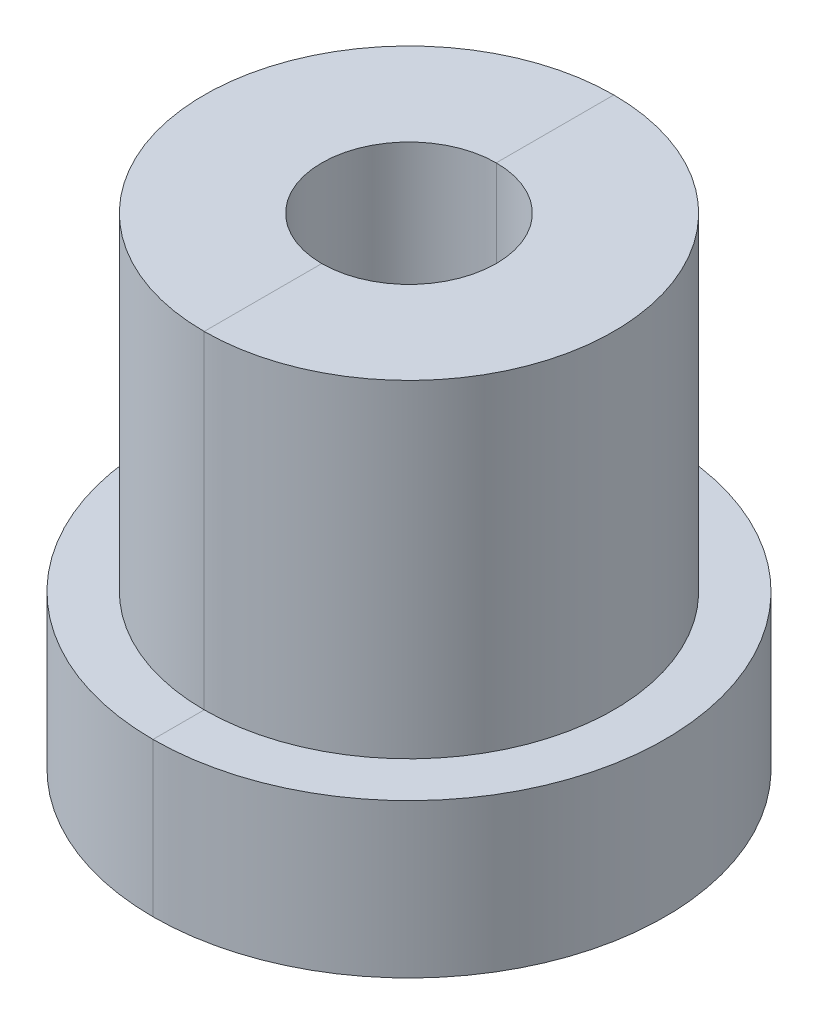
ISO-10303-21;
HEADER;
FILE_DESCRIPTION(('STEP AP214'),'2;1');
FILE_NAME('part.step','',(''),(''),'','','');
FILE_SCHEMA(('AUTOMOTIVE_DESIGN { 1 0 10303 214 1 1 1 1 }'));
ENDSEC;
DATA;
#1=APPLICATION_CONTEXT('core data for automotive mechanical design processes');
#2=APPLICATION_PROTOCOL_DEFINITION('international standard','automotive_design',2000,#1);
#3=PRODUCT_CONTEXT('',#1,'mechanical');
#4=PRODUCT('Part','Part','',(#3));
#5=PRODUCT_RELATED_PRODUCT_CATEGORY('part','',(#4));
#6=PRODUCT_DEFINITION_FORMATION('','',#4);
#7=PRODUCT_DEFINITION_CONTEXT('part definition',#1,'design');
#8=PRODUCT_DEFINITION('design','',#6,#7);
#9=PRODUCT_DEFINITION_SHAPE('','',#8);
#10=(LENGTH_UNIT() NAMED_UNIT(*) SI_UNIT(.MILLI.,.METRE.));
#11=(NAMED_UNIT(*) PLANE_ANGLE_UNIT() SI_UNIT($,.RADIAN.));
#12=(NAMED_UNIT(*) SI_UNIT($,.STERADIAN.) SOLID_ANGLE_UNIT());
#13=UNCERTAINTY_MEASURE_WITH_UNIT(LENGTH_MEASURE(1.E-05),#10,'distance_accuracy_value','');
#14=(GEOMETRIC_REPRESENTATION_CONTEXT(3) GLOBAL_UNCERTAINTY_ASSIGNED_CONTEXT((#13)) GLOBAL_UNIT_ASSIGNED_CONTEXT((#10,
#11,#12)) REPRESENTATION_CONTEXT('',''));
#15=CARTESIAN_POINT('',(0.,0.,0.));
#16=DIRECTION('',(0.,0.,1.));
#17=DIRECTION('',(1.,0.,0.));
#18=AXIS2_PLACEMENT_3D('',#15,#16,#17);
#19=CARTESIAN_POINT('',(0.,0.,0.));
#20=DIRECTION('',(0.,1.,0.));
#21=DIRECTION('',(0.,0.,1.));
#22=AXIS2_PLACEMENT_3D('',#19,#20,#21);
#23=CYLINDRICAL_SURFACE('',#22,2.7051);
#24=CARTESIAN_POINT('',(0.,0.,0.));
#25=DIRECTION('',(0.,1.,0.));
#26=DIRECTION('',(0.,0.,1.));
#27=AXIS2_PLACEMENT_3D('',#24,#25,#26);
#28=CIRCLE('',#27,2.7051);
#29=CARTESIAN_POINT('',(0.,0.,2.7051));
#30=VERTEX_POINT('',#29);
#31=CARTESIAN_POINT('',(0.,0.,-2.7051));
#32=VERTEX_POINT('',#31);
#33=EDGE_CURVE('E117',#30,#32,#28,.T.);
#34=ORIENTED_EDGE('',*,*,#33,.F.);
#35=DIRECTION('',(0.,1.,0.));
#36=VECTOR('',#35,1.);
#37=CARTESIAN_POINT('',(0.,0.,2.7051));
#38=LINE('',#37,#36);
#39=CARTESIAN_POINT('',(0.,14.9225,2.7051));
#40=VERTEX_POINT('',#39);
#41=EDGE_CURVE('E12',#30,#40,#38,.T.);
#42=ORIENTED_EDGE('',*,*,#41,.T.);
#43=CARTESIAN_POINT('',(0.,14.9225,0.));
#44=DIRECTION('',(0.,1.,0.));
#45=DIRECTION('',(0.,0.,1.));
#46=AXIS2_PLACEMENT_3D('',#43,#44,#45);
#47=CIRCLE('',#46,2.7051);
#48=CARTESIAN_POINT('',(0.,14.9225,-2.7051));
#49=VERTEX_POINT('',#48);
#50=EDGE_CURVE('E118',#40,#49,#47,.T.);
#51=ORIENTED_EDGE('',*,*,#50,.T.);
#52=DIRECTION('',(0.,-1.,0.));
#53=VECTOR('',#52,1.);
#54=CARTESIAN_POINT('',(0.,0.,-2.7051));
#55=LINE('',#54,#53);
#56=EDGE_CURVE('E51',#49,#32,#55,.T.);
#57=ORIENTED_EDGE('',*,*,#56,.T.);
#58=EDGE_LOOP('',(#34,#42,#51,#57));
#59=FACE_BOUND('',#58,.T.);
#60=ADVANCED_FACE('F43',(#59),#23,.F.);
#61=CARTESIAN_POINT('',(0.,14.9225,0.));
#62=DIRECTION('',(0.,-1.,0.));
#63=DIRECTION('',(0.,0.,-1.));
#64=AXIS2_PLACEMENT_3D('',#61,#62,#63);
#65=CYLINDRICAL_SURFACE('',#64,6.35);
#66=CARTESIAN_POINT('',(0.,4.7625,0.));
#67=DIRECTION('',(0.,1.,0.));
#68=DIRECTION('',(0.,0.,1.));
#69=AXIS2_PLACEMENT_3D('',#66,#67,#68);
#70=CIRCLE('',#69,6.35);
#71=CARTESIAN_POINT('',(0.,4.7625,6.35));
#72=VERTEX_POINT('',#71);
#73=CARTESIAN_POINT('',(0.,4.7625,-6.35));
#74=VERTEX_POINT('',#73);
#75=EDGE_CURVE('E123',#72,#74,#70,.T.);
#76=ORIENTED_EDGE('',*,*,#75,.T.);
#77=DIRECTION('',(0.,1.,0.));
#78=VECTOR('',#77,1.);
#79=CARTESIAN_POINT('',(0.,14.9225,-6.35));
#80=LINE('',#79,#78);
#81=CARTESIAN_POINT('',(0.,14.9225,-6.35));
#82=VERTEX_POINT('',#81);
#83=EDGE_CURVE('E58',#74,#82,#80,.T.);
#84=ORIENTED_EDGE('',*,*,#83,.T.);
#85=CARTESIAN_POINT('',(0.,14.9225,0.));
#86=DIRECTION('',(0.,1.,0.));
#87=DIRECTION('',(0.,0.,1.));
#88=AXIS2_PLACEMENT_3D('',#85,#86,#87);
#89=CIRCLE('',#88,6.35);
#90=CARTESIAN_POINT('',(0.,14.9225,6.35));
#91=VERTEX_POINT('',#90);
#92=EDGE_CURVE('E127',#91,#82,#89,.T.);
#93=ORIENTED_EDGE('',*,*,#92,.F.);
#94=DIRECTION('',(0.,-1.,0.));
#95=VECTOR('',#94,1.);
#96=CARTESIAN_POINT('',(0.,14.9225,6.35));
#97=LINE('',#96,#95);
#98=EDGE_CURVE('E155',#91,#72,#97,.T.);
#99=ORIENTED_EDGE('',*,*,#98,.T.);
#100=EDGE_LOOP('',(#76,#84,#93,#99));
#101=FACE_BOUND('',#100,.T.);
#102=ADVANCED_FACE('F159',(#101),#65,.T.);
#103=CARTESIAN_POINT('',(0.,4.7625,0.));
#104=DIRECTION('',(0.,-1.,0.));
#105=DIRECTION('',(0.,0.,-1.));
#106=AXIS2_PLACEMENT_3D('',#103,#104,#105);
#107=CYLINDRICAL_SURFACE('',#106,7.9375);
#108=CARTESIAN_POINT('',(0.,0.,0.));
#109=DIRECTION('',(0.,1.,0.));
#110=DIRECTION('',(0.,0.,1.));
#111=AXIS2_PLACEMENT_3D('',#108,#109,#110);
#112=CIRCLE('',#111,7.9375);
#113=CARTESIAN_POINT('',(0.,0.,7.9375));
#114=VERTEX_POINT('',#113);
#115=CARTESIAN_POINT('',(0.,0.,-7.9375));
#116=VERTEX_POINT('',#115);
#117=EDGE_CURVE('E122',#114,#116,#112,.T.);
#118=ORIENTED_EDGE('',*,*,#117,.T.);
#119=DIRECTION('',(0.,1.,0.));
#120=VECTOR('',#119,1.);
#121=CARTESIAN_POINT('',(0.,4.7625,-7.9375));
#122=LINE('',#121,#120);
#123=CARTESIAN_POINT('',(0.,4.7625,-7.9375));
#124=VERTEX_POINT('',#123);
#125=EDGE_CURVE('E66',#116,#124,#122,.T.);
#126=ORIENTED_EDGE('',*,*,#125,.T.);
#127=CARTESIAN_POINT('',(0.,4.7625,0.));
#128=DIRECTION('',(0.,1.,0.));
#129=DIRECTION('',(0.,0.,1.));
#130=AXIS2_PLACEMENT_3D('',#127,#128,#129);
#131=CIRCLE('',#130,7.9375);
#132=CARTESIAN_POINT('',(0.,4.7625,7.9375));
#133=VERTEX_POINT('',#132);
#134=EDGE_CURVE('E136',#133,#124,#131,.T.);
#135=ORIENTED_EDGE('',*,*,#134,.F.);
#136=DIRECTION('',(0.,-1.,0.));
#137=VECTOR('',#136,1.);
#138=CARTESIAN_POINT('',(0.,4.7625,7.9375));
#139=LINE('',#138,#137);
#140=EDGE_CURVE('E152',#133,#114,#139,.T.);
#141=ORIENTED_EDGE('',*,*,#140,.T.);
#142=EDGE_LOOP('',(#118,#126,#135,#141));
#143=FACE_BOUND('',#142,.T.);
#144=ADVANCED_FACE('F184',(#143),#107,.T.);
#145=CARTESIAN_POINT('',(0.,4.7625,0.));
#146=DIRECTION('',(0.,1.,0.));
#147=DIRECTION('',(0.,0.,1.));
#148=AXIS2_PLACEMENT_3D('',#145,#146,#147);
#149=PLANE('',#148);
#150=EDGE_CURVE('E135',#74,#72,#70,.T.);
#151=ORIENTED_EDGE('',*,*,#150,.F.);
#152=DIRECTION('',(0.,0.,-1.));
#153=VECTOR('',#152,1.);
#154=CARTESIAN_POINT('',(0.,4.7625,0.));
#155=LINE('',#154,#153);
#156=EDGE_CURVE('E150',#74,#124,#155,.T.);
#157=ORIENTED_EDGE('',*,*,#156,.T.);
#158=EDGE_CURVE('E139',#124,#133,#131,.T.);
#159=ORIENTED_EDGE('',*,*,#158,.T.);
#160=DIRECTION('',(0.,0.,-1.));
#161=VECTOR('',#160,1.);
#162=CARTESIAN_POINT('',(0.,4.7625,0.));
#163=LINE('',#162,#161);
#164=EDGE_CURVE('E147',#133,#72,#163,.T.);
#165=ORIENTED_EDGE('',*,*,#164,.T.);
#166=EDGE_LOOP('',(#151,#157,#159,#165));
#167=FACE_BOUND('',#166,.T.);
#168=ADVANCED_FACE('F179',(#167),#149,.T.);
#169=CARTESIAN_POINT('',(0.,14.9225,0.));
#170=DIRECTION('',(0.,1.,0.));
#171=DIRECTION('',(0.,0.,1.));
#172=AXIS2_PLACEMENT_3D('',#169,#170,#171);
#173=PLANE('',#172);
#174=EDGE_CURVE('E102',#49,#40,#47,.T.);
#175=ORIENTED_EDGE('',*,*,#174,.F.);
#176=DIRECTION('',(0.,0.,-1.));
#177=VECTOR('',#176,1.);
#178=CARTESIAN_POINT('',(0.,14.9225,0.));
#179=LINE('',#178,#177);
#180=EDGE_CURVE('E144',#49,#82,#179,.T.);
#181=ORIENTED_EDGE('',*,*,#180,.T.);
#182=EDGE_CURVE('E125',#82,#91,#89,.T.);
#183=ORIENTED_EDGE('',*,*,#182,.T.);
#184=DIRECTION('',(0.,0.,-1.));
#185=VECTOR('',#184,1.);
#186=CARTESIAN_POINT('',(0.,14.9225,0.));
#187=LINE('',#186,#185);
#188=EDGE_CURVE('E142',#91,#40,#187,.T.);
#189=ORIENTED_EDGE('',*,*,#188,.T.);
#190=EDGE_LOOP('',(#175,#181,#183,#189));
#191=FACE_BOUND('',#190,.T.);
#192=ADVANCED_FACE('F163',(#191),#173,.T.);
#193=CARTESIAN_POINT('',(0.,0.,0.));
#194=DIRECTION('',(0.,1.,0.));
#195=DIRECTION('',(0.,0.,1.));
#196=AXIS2_PLACEMENT_3D('',#193,#194,#195);
#197=PLANE('',#196);
#198=ORIENTED_EDGE('',*,*,#33,.T.);
#199=DIRECTION('',(0.,0.,-1.));
#200=VECTOR('',#199,1.);
#201=CARTESIAN_POINT('',(0.,0.,0.));
#202=LINE('',#201,#200);
#203=EDGE_CURVE('E116',#32,#116,#202,.T.);
#204=ORIENTED_EDGE('',*,*,#203,.T.);
#205=ORIENTED_EDGE('',*,*,#117,.F.);
#206=DIRECTION('',(0.,0.,-1.));
#207=VECTOR('',#206,1.);
#208=CARTESIAN_POINT('',(0.,0.,0.));
#209=LINE('',#208,#207);
#210=EDGE_CURVE('E113',#114,#30,#209,.T.);
#211=ORIENTED_EDGE('',*,*,#210,.T.);
#212=EDGE_LOOP('',(#198,#204,#205,#211));
#213=FACE_BOUND('',#212,.T.);
#214=ADVANCED_FACE('F121',(#213),#197,.F.);
#215=ORIENTED_EDGE('',*,*,#125,.F.);
#216=EDGE_CURVE('E132',#116,#114,#112,.T.);
#217=ORIENTED_EDGE('',*,*,#216,.T.);
#218=ORIENTED_EDGE('',*,*,#140,.F.);
#219=ORIENTED_EDGE('',*,*,#158,.F.);
#220=EDGE_LOOP('',(#215,#217,#218,#219));
#221=FACE_BOUND('',#220,.T.);
#222=ADVANCED_FACE('F45',(#221),#107,.T.);
#223=ORIENTED_EDGE('',*,*,#156,.F.);
#224=ORIENTED_EDGE('',*,*,#75,.F.);
#225=ORIENTED_EDGE('',*,*,#164,.F.);
#226=ORIENTED_EDGE('',*,*,#134,.T.);
#227=EDGE_LOOP('',(#223,#224,#225,#226));
#228=FACE_BOUND('',#227,.T.);
#229=ADVANCED_FACE('F189',(#228),#149,.T.);
#230=ORIENTED_EDGE('',*,*,#203,.F.);
#231=EDGE_CURVE('E99',#32,#30,#28,.T.);
#232=ORIENTED_EDGE('',*,*,#231,.T.);
#233=ORIENTED_EDGE('',*,*,#210,.F.);
#234=ORIENTED_EDGE('',*,*,#216,.F.);
#235=EDGE_LOOP('',(#230,#232,#233,#234));
#236=FACE_BOUND('',#235,.T.);
#237=ADVANCED_FACE('F111',(#236),#197,.F.);
#238=ORIENTED_EDGE('',*,*,#83,.F.);
#239=ORIENTED_EDGE('',*,*,#150,.T.);
#240=ORIENTED_EDGE('',*,*,#98,.F.);
#241=ORIENTED_EDGE('',*,*,#182,.F.);
#242=EDGE_LOOP('',(#238,#239,#240,#241));
#243=FACE_BOUND('',#242,.T.);
#244=ADVANCED_FACE('F167',(#243),#65,.T.);
#245=ORIENTED_EDGE('',*,*,#180,.F.);
#246=ORIENTED_EDGE('',*,*,#50,.F.);
#247=ORIENTED_EDGE('',*,*,#188,.F.);
#248=ORIENTED_EDGE('',*,*,#92,.T.);
#249=EDGE_LOOP('',(#245,#246,#247,#248));
#250=FACE_BOUND('',#249,.T.);
#251=ADVANCED_FACE('F168',(#250),#173,.T.);
#252=ORIENTED_EDGE('',*,*,#41,.F.);
#253=ORIENTED_EDGE('',*,*,#231,.F.);
#254=ORIENTED_EDGE('',*,*,#56,.F.);
#255=ORIENTED_EDGE('',*,*,#174,.T.);
#256=EDGE_LOOP('',(#252,#253,#254,#255));
#257=FACE_BOUND('',#256,.T.);
#258=ADVANCED_FACE('F98',(#257),#23,.F.);
#259=CLOSED_SHELL('',(#60,#102,#144,#168,#192,#214,#222,#229,#237,#244,#251,#258));
#260=MANIFOLD_SOLID_BREP('B2',#259);
#261=ADVANCED_BREP_SHAPE_REPRESENTATION('',(#18,#260),#14);
#262=SHAPE_DEFINITION_REPRESENTATION(#9,#261);
ENDSEC;
END-ISO-10303-21;
